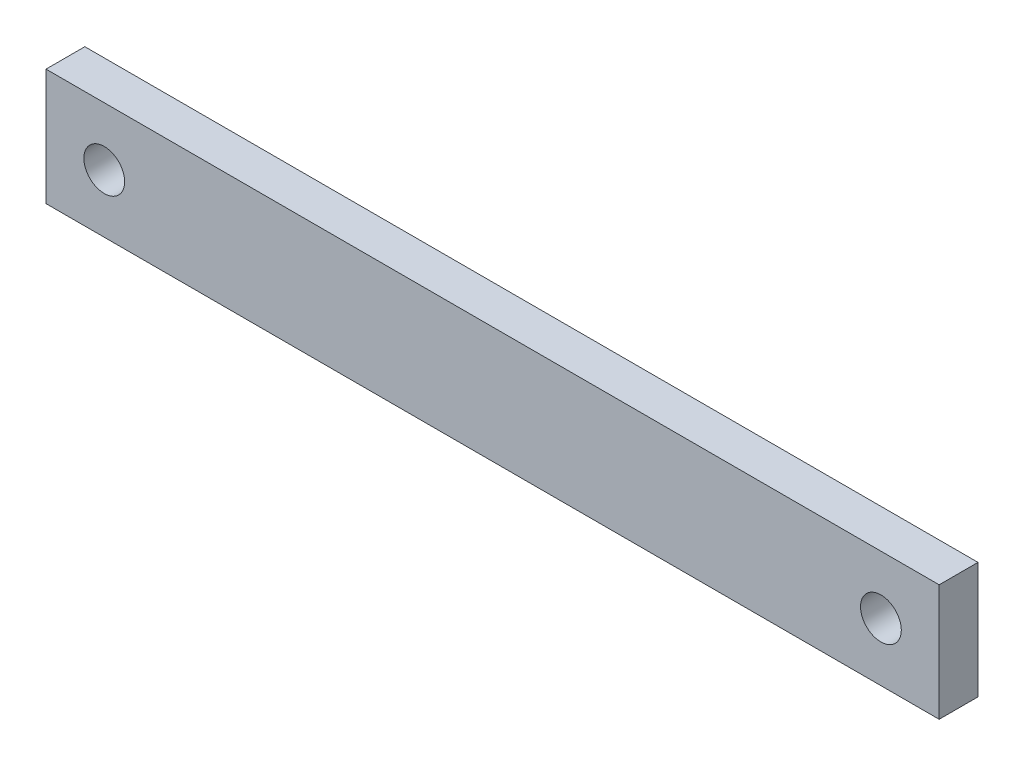
ISO-10303-21;
HEADER;
FILE_DESCRIPTION(('STEP AP214'),'2;1');
FILE_NAME('part.step','',(''),(''),'','','');
FILE_SCHEMA(('AUTOMOTIVE_DESIGN { 1 0 10303 214 1 1 1 1 }'));
ENDSEC;
DATA;
#1=APPLICATION_CONTEXT('core data for automotive mechanical design processes');
#2=APPLICATION_PROTOCOL_DEFINITION('international standard','automotive_design',2000,#1);
#3=PRODUCT_CONTEXT('',#1,'mechanical');
#4=PRODUCT('Part','Part','',(#3));
#5=PRODUCT_RELATED_PRODUCT_CATEGORY('part','',(#4));
#6=PRODUCT_DEFINITION_FORMATION('','',#4);
#7=PRODUCT_DEFINITION_CONTEXT('part definition',#1,'design');
#8=PRODUCT_DEFINITION('design','',#6,#7);
#9=PRODUCT_DEFINITION_SHAPE('','',#8);
#10=(LENGTH_UNIT() NAMED_UNIT(*) SI_UNIT(.MILLI.,.METRE.));
#11=(NAMED_UNIT(*) PLANE_ANGLE_UNIT() SI_UNIT($,.RADIAN.));
#12=(NAMED_UNIT(*) SI_UNIT($,.STERADIAN.) SOLID_ANGLE_UNIT());
#13=UNCERTAINTY_MEASURE_WITH_UNIT(LENGTH_MEASURE(1.E-05),#10,'distance_accuracy_value','');
#14=(GEOMETRIC_REPRESENTATION_CONTEXT(3) GLOBAL_UNCERTAINTY_ASSIGNED_CONTEXT((#13)) GLOBAL_UNIT_ASSIGNED_CONTEXT((#10,
#11,#12)) REPRESENTATION_CONTEXT('',''));
#15=CARTESIAN_POINT('',(0.,0.,0.));
#16=DIRECTION('',(0.,0.,1.));
#17=DIRECTION('',(1.,0.,0.));
#18=AXIS2_PLACEMENT_3D('',#15,#16,#17);
#19=CARTESIAN_POINT('',(0.,0.,2.));
#20=DIRECTION('',(0.,0.,-1.));
#21=DIRECTION('',(-1.,0.,0.));
#22=AXIS2_PLACEMENT_3D('',#19,#20,#21);
#23=PLANE('',#22);
#24=DIRECTION('',(0.,-1.,0.));
#25=VECTOR('',#24,1.);
#26=CARTESIAN_POINT('',(-3.,-3.,2.));
#27=LINE('',#26,#25);
#28=CARTESIAN_POINT('',(-3.,3.,2.));
#29=VERTEX_POINT('',#28);
#30=CARTESIAN_POINT('',(-3.,-3.,2.));
#31=VERTEX_POINT('',#30);
#32=EDGE_CURVE('E92',#29,#31,#27,.T.);
#33=ORIENTED_EDGE('',*,*,#32,.T.);
#34=DIRECTION('',(1.,0.,0.));
#35=VECTOR('',#34,1.);
#36=CARTESIAN_POINT('',(-3.,-3.,2.));
#37=LINE('',#36,#35);
#38=CARTESIAN_POINT('',(43.,-3.,2.));
#39=VERTEX_POINT('',#38);
#40=EDGE_CURVE('E87',#31,#39,#37,.T.);
#41=ORIENTED_EDGE('',*,*,#40,.T.);
#42=DIRECTION('',(0.,1.,0.));
#43=VECTOR('',#42,1.);
#44=CARTESIAN_POINT('',(43.,-3.,2.));
#45=LINE('',#44,#43);
#46=CARTESIAN_POINT('',(43.,3.,2.));
#47=VERTEX_POINT('',#46);
#48=EDGE_CURVE('E86',#39,#47,#45,.T.);
#49=ORIENTED_EDGE('',*,*,#48,.T.);
#50=DIRECTION('',(-1.,0.,0.));
#51=VECTOR('',#50,1.);
#52=CARTESIAN_POINT('',(-3.,3.,2.));
#53=LINE('',#52,#51);
#54=EDGE_CURVE('E57',#47,#29,#53,.T.);
#55=ORIENTED_EDGE('',*,*,#54,.T.);
#56=EDGE_LOOP('',(#33,#41,#49,#55));
#57=FACE_BOUND('',#56,.T.);
#58=CARTESIAN_POINT('',(0.,0.,2.));
#59=DIRECTION('',(0.,0.,1.));
#60=DIRECTION('',(1.,0.,0.));
#61=AXIS2_PLACEMENT_3D('',#58,#59,#60);
#62=CIRCLE('',#61,1.05);
#63=CARTESIAN_POINT('',(1.05,0.,2.));
#64=VERTEX_POINT('',#63);
#65=EDGE_CURVE('E106',#64,#64,#62,.T.);
#66=ORIENTED_EDGE('',*,*,#65,.F.);
#67=EDGE_LOOP('',(#66));
#68=FACE_BOUND('',#67,.T.);
#69=CARTESIAN_POINT('',(40.,0.,2.));
#70=DIRECTION('',(0.,0.,1.));
#71=DIRECTION('',(1.,0.,0.));
#72=AXIS2_PLACEMENT_3D('',#69,#70,#71);
#73=CIRCLE('',#72,1.05);
#74=CARTESIAN_POINT('',(41.05,0.,2.));
#75=VERTEX_POINT('',#74);
#76=EDGE_CURVE('E122',#75,#75,#73,.T.);
#77=ORIENTED_EDGE('',*,*,#76,.F.);
#78=EDGE_LOOP('',(#77));
#79=FACE_BOUND('',#78,.T.);
#80=ADVANCED_FACE('F39',(#57,#68,#79),#23,.F.);
#81=CARTESIAN_POINT('',(0.,0.,0.));
#82=DIRECTION('',(0.,0.,-1.));
#83=DIRECTION('',(-1.,0.,0.));
#84=AXIS2_PLACEMENT_3D('',#81,#82,#83);
#85=PLANE('',#84);
#86=CARTESIAN_POINT('',(0.,0.,0.));
#87=DIRECTION('',(0.,0.,1.));
#88=DIRECTION('',(1.,0.,0.));
#89=AXIS2_PLACEMENT_3D('',#86,#87,#88);
#90=CIRCLE('',#89,1.05);
#91=CARTESIAN_POINT('',(1.05,0.,0.));
#92=VERTEX_POINT('',#91);
#93=EDGE_CURVE('E117',#92,#92,#90,.T.);
#94=ORIENTED_EDGE('',*,*,#93,.T.);
#95=EDGE_LOOP('',(#94));
#96=FACE_BOUND('',#95,.T.);
#97=DIRECTION('',(0.,-1.,0.));
#98=VECTOR('',#97,1.);
#99=CARTESIAN_POINT('',(-3.,-3.,0.));
#100=LINE('',#99,#98);
#101=CARTESIAN_POINT('',(-3.,3.,0.));
#102=VERTEX_POINT('',#101);
#103=CARTESIAN_POINT('',(-3.,-3.,0.));
#104=VERTEX_POINT('',#103);
#105=EDGE_CURVE('E101',#102,#104,#100,.T.);
#106=ORIENTED_EDGE('',*,*,#105,.F.);
#107=DIRECTION('',(-1.,0.,0.));
#108=VECTOR('',#107,1.);
#109=CARTESIAN_POINT('',(-3.,3.,0.));
#110=LINE('',#109,#108);
#111=CARTESIAN_POINT('',(43.,3.,0.));
#112=VERTEX_POINT('',#111);
#113=EDGE_CURVE('E79',#112,#102,#110,.T.);
#114=ORIENTED_EDGE('',*,*,#113,.F.);
#115=DIRECTION('',(0.,1.,0.));
#116=VECTOR('',#115,1.);
#117=CARTESIAN_POINT('',(43.,-3.,0.));
#118=LINE('',#117,#116);
#119=CARTESIAN_POINT('',(43.,-3.,0.));
#120=VERTEX_POINT('',#119);
#121=EDGE_CURVE('E75',#120,#112,#118,.T.);
#122=ORIENTED_EDGE('',*,*,#121,.F.);
#123=DIRECTION('',(1.,0.,0.));
#124=VECTOR('',#123,1.);
#125=CARTESIAN_POINT('',(-3.,-3.,0.));
#126=LINE('',#125,#124);
#127=EDGE_CURVE('E93',#104,#120,#126,.T.);
#128=ORIENTED_EDGE('',*,*,#127,.F.);
#129=EDGE_LOOP('',(#106,#114,#122,#128));
#130=FACE_BOUND('',#129,.T.);
#131=CARTESIAN_POINT('',(40.,0.,0.));
#132=DIRECTION('',(0.,0.,1.));
#133=DIRECTION('',(1.,0.,0.));
#134=AXIS2_PLACEMENT_3D('',#131,#132,#133);
#135=CIRCLE('',#134,1.05);
#136=CARTESIAN_POINT('',(41.05,0.,0.));
#137=VERTEX_POINT('',#136);
#138=EDGE_CURVE('E121',#137,#137,#135,.T.);
#139=ORIENTED_EDGE('',*,*,#138,.T.);
#140=EDGE_LOOP('',(#139));
#141=FACE_BOUND('',#140,.T.);
#142=ADVANCED_FACE('F112',(#96,#130,#141),#85,.T.);
#143=CARTESIAN_POINT('',(-3.,-3.,2.));
#144=DIRECTION('',(1.,0.,0.));
#145=DIRECTION('',(0.,0.,-1.));
#146=AXIS2_PLACEMENT_3D('',#143,#144,#145);
#147=PLANE('',#146);
#148=ORIENTED_EDGE('',*,*,#105,.T.);
#149=DIRECTION('',(0.,0.,-1.));
#150=VECTOR('',#149,1.);
#151=CARTESIAN_POINT('',(-3.,-3.,2.));
#152=LINE('',#151,#150);
#153=EDGE_CURVE('E11',#31,#104,#152,.T.);
#154=ORIENTED_EDGE('',*,*,#153,.F.);
#155=ORIENTED_EDGE('',*,*,#32,.F.);
#156=DIRECTION('',(0.,0.,-1.));
#157=VECTOR('',#156,1.);
#158=CARTESIAN_POINT('',(-3.,3.,2.));
#159=LINE('',#158,#157);
#160=EDGE_CURVE('E100',#29,#102,#159,.T.);
#161=ORIENTED_EDGE('',*,*,#160,.T.);
#162=EDGE_LOOP('',(#148,#154,#155,#161));
#163=FACE_BOUND('',#162,.T.);
#164=ADVANCED_FACE('F41',(#163),#147,.F.);
#165=CARTESIAN_POINT('',(-3.,-3.,2.));
#166=DIRECTION('',(0.,1.,0.));
#167=DIRECTION('',(0.,0.,1.));
#168=AXIS2_PLACEMENT_3D('',#165,#166,#167);
#169=PLANE('',#168);
#170=ORIENTED_EDGE('',*,*,#127,.T.);
#171=DIRECTION('',(0.,0.,-1.));
#172=VECTOR('',#171,1.);
#173=CARTESIAN_POINT('',(43.,-3.,2.));
#174=LINE('',#173,#172);
#175=EDGE_CURVE('E48',#39,#120,#174,.T.);
#176=ORIENTED_EDGE('',*,*,#175,.F.);
#177=ORIENTED_EDGE('',*,*,#40,.F.);
#178=ORIENTED_EDGE('',*,*,#153,.T.);
#179=EDGE_LOOP('',(#170,#176,#177,#178));
#180=FACE_BOUND('',#179,.T.);
#181=ADVANCED_FACE('F91',(#180),#169,.F.);
#182=CARTESIAN_POINT('',(43.,-3.,2.));
#183=DIRECTION('',(-1.,0.,0.));
#184=DIRECTION('',(0.,0.,1.));
#185=AXIS2_PLACEMENT_3D('',#182,#183,#184);
#186=PLANE('',#185);
#187=ORIENTED_EDGE('',*,*,#121,.T.);
#188=DIRECTION('',(0.,0.,-1.));
#189=VECTOR('',#188,1.);
#190=CARTESIAN_POINT('',(43.,3.,2.));
#191=LINE('',#190,#189);
#192=EDGE_CURVE('E98',#47,#112,#191,.T.);
#193=ORIENTED_EDGE('',*,*,#192,.F.);
#194=ORIENTED_EDGE('',*,*,#48,.F.);
#195=ORIENTED_EDGE('',*,*,#175,.T.);
#196=EDGE_LOOP('',(#187,#193,#194,#195));
#197=FACE_BOUND('',#196,.T.);
#198=ADVANCED_FACE('F97',(#197),#186,.F.);
#199=CARTESIAN_POINT('',(-3.,3.,2.));
#200=DIRECTION('',(0.,-1.,0.));
#201=DIRECTION('',(0.,0.,-1.));
#202=AXIS2_PLACEMENT_3D('',#199,#200,#201);
#203=PLANE('',#202);
#204=ORIENTED_EDGE('',*,*,#113,.T.);
#205=ORIENTED_EDGE('',*,*,#160,.F.);
#206=ORIENTED_EDGE('',*,*,#54,.F.);
#207=ORIENTED_EDGE('',*,*,#192,.T.);
#208=EDGE_LOOP('',(#204,#205,#206,#207));
#209=FACE_BOUND('',#208,.T.);
#210=ADVANCED_FACE('F111',(#209),#203,.F.);
#211=CARTESIAN_POINT('',(0.,0.,2.));
#212=DIRECTION('',(0.,0.,-1.));
#213=DIRECTION('',(-1.,0.,0.));
#214=AXIS2_PLACEMENT_3D('',#211,#212,#213);
#215=CYLINDRICAL_SURFACE('',#214,1.05);
#216=ORIENTED_EDGE('',*,*,#65,.T.);
#217=EDGE_LOOP('',(#216));
#218=FACE_BOUND('',#217,.T.);
#219=ORIENTED_EDGE('',*,*,#93,.F.);
#220=EDGE_LOOP('',(#219));
#221=FACE_BOUND('',#220,.T.);
#222=ADVANCED_FACE('F142',(#218,#221),#215,.F.);
#223=CARTESIAN_POINT('',(40.,0.,2.));
#224=DIRECTION('',(0.,0.,-1.));
#225=DIRECTION('',(-1.,0.,0.));
#226=AXIS2_PLACEMENT_3D('',#223,#224,#225);
#227=CYLINDRICAL_SURFACE('',#226,1.05);
#228=ORIENTED_EDGE('',*,*,#76,.T.);
#229=EDGE_LOOP('',(#228));
#230=FACE_BOUND('',#229,.T.);
#231=ORIENTED_EDGE('',*,*,#138,.F.);
#232=EDGE_LOOP('',(#231));
#233=FACE_BOUND('',#232,.T.);
#234=ADVANCED_FACE('F127',(#230,#233),#227,.F.);
#235=CLOSED_SHELL('',(#80,#142,#164,#181,#198,#210,#222,#234));
#236=MANIFOLD_SOLID_BREP('B2',#235);
#237=ADVANCED_BREP_SHAPE_REPRESENTATION('',(#18,#236),#14);
#238=SHAPE_DEFINITION_REPRESENTATION(#9,#237);
ENDSEC;
END-ISO-10303-21;
